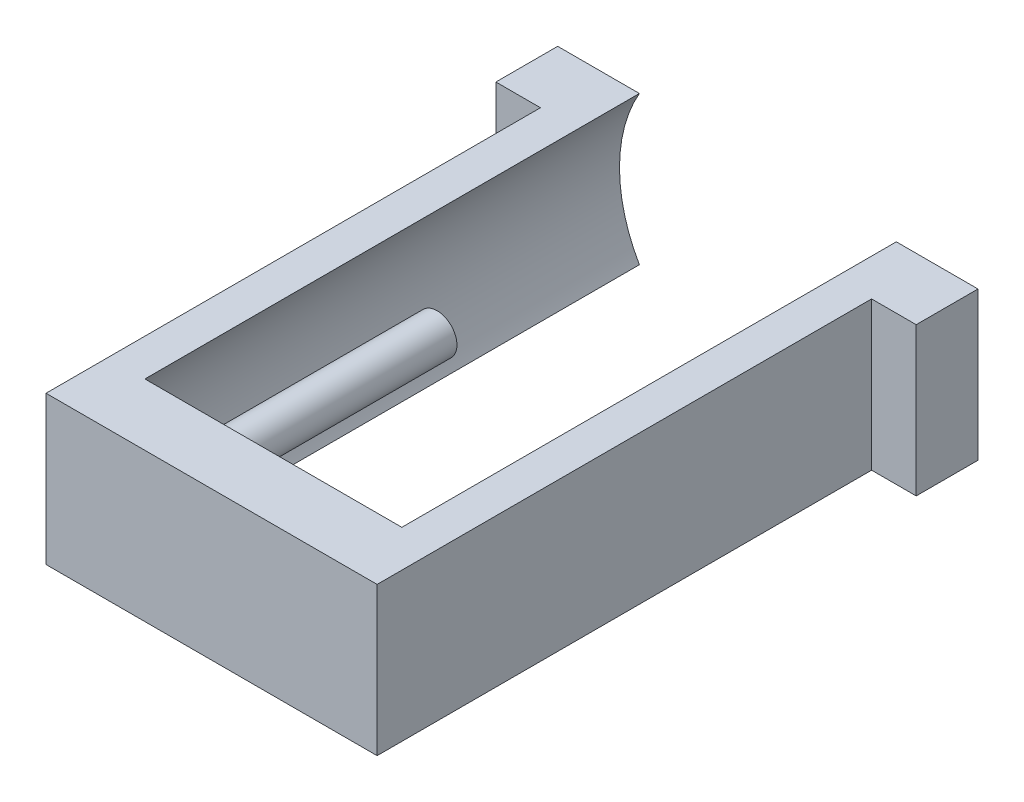
ISO-10303-21;
HEADER;
FILE_DESCRIPTION(('STEP AP214'),'2;1');
FILE_NAME('part.step','',(''),(''),'','','');
FILE_SCHEMA(('AUTOMOTIVE_DESIGN { 1 0 10303 214 1 1 1 1 }'));
ENDSEC;
DATA;
#1=APPLICATION_CONTEXT('core data for automotive mechanical design processes');
#2=APPLICATION_PROTOCOL_DEFINITION('international standard','automotive_design',2000,#1);
#3=PRODUCT_CONTEXT('',#1,'mechanical');
#4=PRODUCT('Part','Part','',(#3));
#5=PRODUCT_RELATED_PRODUCT_CATEGORY('part','',(#4));
#6=PRODUCT_DEFINITION_FORMATION('','',#4);
#7=PRODUCT_DEFINITION_CONTEXT('part definition',#1,'design');
#8=PRODUCT_DEFINITION('design','',#6,#7);
#9=PRODUCT_DEFINITION_SHAPE('','',#8);
#10=(LENGTH_UNIT() NAMED_UNIT(*) SI_UNIT(.MILLI.,.METRE.));
#11=(NAMED_UNIT(*) PLANE_ANGLE_UNIT() SI_UNIT($,.RADIAN.));
#12=(NAMED_UNIT(*) SI_UNIT($,.STERADIAN.) SOLID_ANGLE_UNIT());
#13=UNCERTAINTY_MEASURE_WITH_UNIT(LENGTH_MEASURE(1.E-05),#10,'distance_accuracy_value','');
#14=(GEOMETRIC_REPRESENTATION_CONTEXT(3) GLOBAL_UNCERTAINTY_ASSIGNED_CONTEXT((#13)) GLOBAL_UNIT_ASSIGNED_CONTEXT((#10,
#11,#12)) REPRESENTATION_CONTEXT('',''));
#15=CARTESIAN_POINT('',(0.,0.,0.));
#16=DIRECTION('',(0.,0.,1.));
#17=DIRECTION('',(1.,0.,0.));
#18=AXIS2_PLACEMENT_3D('',#15,#16,#17);
#19=CARTESIAN_POINT('',(0.,0.,5.));
#20=DIRECTION('',(0.,0.,-1.));
#21=DIRECTION('',(-1.,0.,0.));
#22=AXIS2_PLACEMENT_3D('',#19,#20,#21);
#23=CYLINDRICAL_SURFACE('',#22,12.);
#24=CARTESIAN_POINT('',(0.,0.,0.));
#25=DIRECTION('',(0.,0.,-1.));
#26=DIRECTION('',(1.,0.,0.));
#27=AXIS2_PLACEMENT_3D('',#24,#25,#26);
#28=CIRCLE('',#27,12.);
#29=CARTESIAN_POINT('',(-10.3923048454133,-6.,0.));
#30=VERTEX_POINT('',#29);
#31=CARTESIAN_POINT('',(-10.3923048454133,6.,0.));
#32=VERTEX_POINT('',#31);
#33=EDGE_CURVE('E231',#30,#32,#28,.T.);
#34=ORIENTED_EDGE('',*,*,#33,.T.);
#35=DIRECTION('',(0.,0.,-1.));
#36=VECTOR('',#35,1.);
#37=CARTESIAN_POINT('',(-10.3923048454133,6.,5.));
#38=LINE('',#37,#36);
#39=CARTESIAN_POINT('',(-10.3923048454133,6.,40.));
#40=VERTEX_POINT('',#39);
#41=EDGE_CURVE('E11',#40,#32,#38,.T.);
#42=ORIENTED_EDGE('',*,*,#41,.F.);
#43=CARTESIAN_POINT('',(0.,0.,40.));
#44=DIRECTION('',(0.,0.,-1.));
#45=DIRECTION('',(1.,0.,0.));
#46=AXIS2_PLACEMENT_3D('',#43,#44,#45);
#47=CIRCLE('',#46,12.);
#48=CARTESIAN_POINT('',(-10.3923048454133,-6.,40.));
#49=VERTEX_POINT('',#48);
#50=EDGE_CURVE('E198',#49,#40,#47,.T.);
#51=ORIENTED_EDGE('',*,*,#50,.F.);
#52=DIRECTION('',(0.,0.,-1.));
#53=VECTOR('',#52,1.);
#54=CARTESIAN_POINT('',(-10.3923048454133,-6.,5.));
#55=LINE('',#54,#53);
#56=EDGE_CURVE('E206',#49,#30,#55,.T.);
#57=ORIENTED_EDGE('',*,*,#56,.T.);
#58=EDGE_LOOP('',(#34,#42,#51,#57));
#59=FACE_BOUND('',#58,.T.);
#60=ADVANCED_FACE('F33',(#59),#23,.F.);
#61=CARTESIAN_POINT('',(-17.,6.,5.));
#62=DIRECTION('',(0.,-1.,0.));
#63=DIRECTION('',(0.,0.,-1.));
#64=AXIS2_PLACEMENT_3D('',#61,#62,#63);
#65=PLANE('',#64);
#66=DIRECTION('',(-1.,0.,0.));
#67=VECTOR('',#66,1.);
#68=CARTESIAN_POINT('',(-17.,6.,0.));
#69=LINE('',#68,#67);
#70=CARTESIAN_POINT('',(-17.,6.,0.));
#71=VERTEX_POINT('',#70);
#72=EDGE_CURVE('E233',#32,#71,#69,.T.);
#73=ORIENTED_EDGE('',*,*,#72,.T.);
#74=DIRECTION('',(0.,0.,-1.));
#75=VECTOR('',#74,1.);
#76=CARTESIAN_POINT('',(-17.,6.,5.));
#77=LINE('',#76,#75);
#78=CARTESIAN_POINT('',(-17.,6.,5.));
#79=VERTEX_POINT('',#78);
#80=EDGE_CURVE('E42',#79,#71,#77,.T.);
#81=ORIENTED_EDGE('',*,*,#80,.F.);
#82=DIRECTION('',(-1.,0.,0.));
#83=VECTOR('',#82,1.);
#84=CARTESIAN_POINT('',(-17.,6.,5.));
#85=LINE('',#84,#83);
#86=CARTESIAN_POINT('',(-13.3923048454133,6.,5.));
#87=VERTEX_POINT('',#86);
#88=EDGE_CURVE('E222',#87,#79,#85,.T.);
#89=ORIENTED_EDGE('',*,*,#88,.F.);
#90=DIRECTION('',(0.,0.,-1.));
#91=VECTOR('',#90,1.);
#92=CARTESIAN_POINT('',(-13.3923048454133,6.,40.));
#93=LINE('',#92,#91);
#94=CARTESIAN_POINT('',(-13.3923048454133,6.,45.));
#95=VERTEX_POINT('',#94);
#96=EDGE_CURVE('E234',#95,#87,#93,.T.);
#97=ORIENTED_EDGE('',*,*,#96,.F.);
#98=DIRECTION('',(-1.,0.,0.));
#99=VECTOR('',#98,1.);
#100=CARTESIAN_POINT('',(-13.3923048454133,6.,45.));
#101=LINE('',#100,#99);
#102=CARTESIAN_POINT('',(13.3923048454133,6.,45.));
#103=VERTEX_POINT('',#102);
#104=EDGE_CURVE('E179',#103,#95,#101,.T.);
#105=ORIENTED_EDGE('',*,*,#104,.F.);
#106=DIRECTION('',(0.,0.,-1.));
#107=VECTOR('',#106,1.);
#108=CARTESIAN_POINT('',(13.3923048454133,6.,45.));
#109=LINE('',#108,#107);
#110=CARTESIAN_POINT('',(13.3923048454133,6.,5.));
#111=VERTEX_POINT('',#110);
#112=EDGE_CURVE('E174',#103,#111,#109,.T.);
#113=ORIENTED_EDGE('',*,*,#112,.T.);
#114=DIRECTION('',(1.,0.,0.));
#115=VECTOR('',#114,1.);
#116=CARTESIAN_POINT('',(17.,6.,5.));
#117=LINE('',#116,#115);
#118=CARTESIAN_POINT('',(17.,6.,5.));
#119=VERTEX_POINT('',#118);
#120=EDGE_CURVE('E147',#111,#119,#117,.T.);
#121=ORIENTED_EDGE('',*,*,#120,.T.);
#122=DIRECTION('',(0.,0.,-1.));
#123=VECTOR('',#122,1.);
#124=CARTESIAN_POINT('',(17.,6.,5.));
#125=LINE('',#124,#123);
#126=CARTESIAN_POINT('',(17.,6.,0.));
#127=VERTEX_POINT('',#126);
#128=EDGE_CURVE('E135',#119,#127,#125,.T.);
#129=ORIENTED_EDGE('',*,*,#128,.T.);
#130=DIRECTION('',(1.,0.,0.));
#131=VECTOR('',#130,1.);
#132=CARTESIAN_POINT('',(17.,6.,0.));
#133=LINE('',#132,#131);
#134=CARTESIAN_POINT('',(10.3923048454133,6.,0.));
#135=VERTEX_POINT('',#134);
#136=EDGE_CURVE('E143',#135,#127,#133,.T.);
#137=ORIENTED_EDGE('',*,*,#136,.F.);
#138=DIRECTION('',(0.,0.,-1.));
#139=VECTOR('',#138,1.);
#140=CARTESIAN_POINT('',(10.3923048454133,6.,40.));
#141=LINE('',#140,#139);
#142=CARTESIAN_POINT('',(10.3923048454133,6.00000000000001,40.));
#143=VERTEX_POINT('',#142);
#144=EDGE_CURVE('E163',#143,#135,#141,.T.);
#145=ORIENTED_EDGE('',*,*,#144,.F.);
#146=DIRECTION('',(-1.,0.,0.));
#147=VECTOR('',#146,1.);
#148=CARTESIAN_POINT('',(-13.3923048454133,6.,40.));
#149=LINE('',#148,#147);
#150=EDGE_CURVE('E36',#143,#40,#149,.T.);
#151=ORIENTED_EDGE('',*,*,#150,.T.);
#152=ORIENTED_EDGE('',*,*,#41,.T.);
#153=EDGE_LOOP('',(#73,#81,#89,#97,#105,#113,#121,#129,#137,#145,#151,#152));
#154=FACE_BOUND('',#153,.T.);
#155=ADVANCED_FACE('F259',(#154),#65,.F.);
#156=CARTESIAN_POINT('',(-17.,6.,5.));
#157=DIRECTION('',(1.,0.,0.));
#158=DIRECTION('',(0.,0.,-1.));
#159=AXIS2_PLACEMENT_3D('',#156,#157,#158);
#160=PLANE('',#159);
#161=DIRECTION('',(0.,-1.,0.));
#162=VECTOR('',#161,1.);
#163=CARTESIAN_POINT('',(-17.,6.,0.));
#164=LINE('',#163,#162);
#165=CARTESIAN_POINT('',(-17.,-6.,0.));
#166=VERTEX_POINT('',#165);
#167=EDGE_CURVE('E236',#71,#166,#164,.T.);
#168=ORIENTED_EDGE('',*,*,#167,.T.);
#169=DIRECTION('',(0.,0.,-1.));
#170=VECTOR('',#169,1.);
#171=CARTESIAN_POINT('',(-17.,-6.,5.));
#172=LINE('',#171,#170);
#173=CARTESIAN_POINT('',(-17.,-6.,5.));
#174=VERTEX_POINT('',#173);
#175=EDGE_CURVE('E208',#174,#166,#172,.T.);
#176=ORIENTED_EDGE('',*,*,#175,.F.);
#177=DIRECTION('',(0.,-1.,0.));
#178=VECTOR('',#177,1.);
#179=CARTESIAN_POINT('',(-17.,6.,5.));
#180=LINE('',#179,#178);
#181=EDGE_CURVE('E217',#79,#174,#180,.T.);
#182=ORIENTED_EDGE('',*,*,#181,.F.);
#183=ORIENTED_EDGE('',*,*,#80,.T.);
#184=EDGE_LOOP('',(#168,#176,#182,#183));
#185=FACE_BOUND('',#184,.T.);
#186=ADVANCED_FACE('F244',(#185),#160,.F.);
#187=CARTESIAN_POINT('',(-17.,-6.,5.));
#188=DIRECTION('',(0.,1.,0.));
#189=DIRECTION('',(0.,0.,1.));
#190=AXIS2_PLACEMENT_3D('',#187,#188,#189);
#191=PLANE('',#190);
#192=DIRECTION('',(1.,0.,0.));
#193=VECTOR('',#192,1.);
#194=CARTESIAN_POINT('',(-17.,-6.,0.));
#195=LINE('',#194,#193);
#196=EDGE_CURVE('E238',#166,#30,#195,.T.);
#197=ORIENTED_EDGE('',*,*,#196,.T.);
#198=ORIENTED_EDGE('',*,*,#56,.F.);
#199=DIRECTION('',(1.,0.,0.));
#200=VECTOR('',#199,1.);
#201=CARTESIAN_POINT('',(-13.3923048454133,-6.,40.));
#202=LINE('',#201,#200);
#203=CARTESIAN_POINT('',(10.3923048454133,-5.99999999999999,40.));
#204=VERTEX_POINT('',#203);
#205=EDGE_CURVE('E183',#49,#204,#202,.T.);
#206=ORIENTED_EDGE('',*,*,#205,.T.);
#207=DIRECTION('',(0.,0.,-1.));
#208=VECTOR('',#207,1.);
#209=CARTESIAN_POINT('',(10.3923048454133,-6.,40.));
#210=LINE('',#209,#208);
#211=CARTESIAN_POINT('',(10.3923048454133,-6.,0.));
#212=VERTEX_POINT('',#211);
#213=EDGE_CURVE('E166',#204,#212,#210,.T.);
#214=ORIENTED_EDGE('',*,*,#213,.T.);
#215=DIRECTION('',(-1.,0.,0.));
#216=VECTOR('',#215,1.);
#217=CARTESIAN_POINT('',(17.,-6.,0.));
#218=LINE('',#217,#216);
#219=CARTESIAN_POINT('',(17.,-6.,0.));
#220=VERTEX_POINT('',#219);
#221=EDGE_CURVE('E129',#220,#212,#218,.T.);
#222=ORIENTED_EDGE('',*,*,#221,.F.);
#223=DIRECTION('',(0.,0.,-1.));
#224=VECTOR('',#223,1.);
#225=CARTESIAN_POINT('',(17.,-6.,5.));
#226=LINE('',#225,#224);
#227=CARTESIAN_POINT('',(17.,-6.,5.));
#228=VERTEX_POINT('',#227);
#229=EDGE_CURVE('E123',#228,#220,#226,.T.);
#230=ORIENTED_EDGE('',*,*,#229,.F.);
#231=DIRECTION('',(-1.,0.,0.));
#232=VECTOR('',#231,1.);
#233=CARTESIAN_POINT('',(17.,-6.,5.));
#234=LINE('',#233,#232);
#235=CARTESIAN_POINT('',(13.3923048454133,-6.,5.));
#236=VERTEX_POINT('',#235);
#237=EDGE_CURVE('E127',#228,#236,#234,.T.);
#238=ORIENTED_EDGE('',*,*,#237,.T.);
#239=DIRECTION('',(0.,0.,-1.));
#240=VECTOR('',#239,1.);
#241=CARTESIAN_POINT('',(13.3923048454133,-6.,45.));
#242=LINE('',#241,#240);
#243=CARTESIAN_POINT('',(13.3923048454133,-6.,45.));
#244=VERTEX_POINT('',#243);
#245=EDGE_CURVE('E177',#244,#236,#242,.T.);
#246=ORIENTED_EDGE('',*,*,#245,.F.);
#247=DIRECTION('',(1.,0.,0.));
#248=VECTOR('',#247,1.);
#249=CARTESIAN_POINT('',(-13.3923048454133,-6.,45.));
#250=LINE('',#249,#248);
#251=CARTESIAN_POINT('',(-13.3923048454133,-6.,45.));
#252=VERTEX_POINT('',#251);
#253=EDGE_CURVE('E186',#252,#244,#250,.T.);
#254=ORIENTED_EDGE('',*,*,#253,.F.);
#255=DIRECTION('',(0.,0.,-1.));
#256=VECTOR('',#255,1.);
#257=CARTESIAN_POINT('',(-13.3923048454133,-6.,40.));
#258=LINE('',#257,#256);
#259=CARTESIAN_POINT('',(-13.3923048454133,-6.,5.));
#260=VERTEX_POINT('',#259);
#261=EDGE_CURVE('E200',#252,#260,#258,.T.);
#262=ORIENTED_EDGE('',*,*,#261,.T.);
#263=DIRECTION('',(1.,0.,0.));
#264=VECTOR('',#263,1.);
#265=CARTESIAN_POINT('',(-17.,-6.,5.));
#266=LINE('',#265,#264);
#267=EDGE_CURVE('E209',#174,#260,#266,.T.);
#268=ORIENTED_EDGE('',*,*,#267,.F.);
#269=ORIENTED_EDGE('',*,*,#175,.T.);
#270=EDGE_LOOP('',(#197,#198,#206,#214,#222,#230,#238,#246,#254,#262,#268,#269));
#271=FACE_BOUND('',#270,.T.);
#272=ADVANCED_FACE('F125',(#271),#191,.F.);
#273=CARTESIAN_POINT('',(0.,0.,5.));
#274=DIRECTION('',(0.,0.,1.));
#275=DIRECTION('',(1.,0.,0.));
#276=AXIS2_PLACEMENT_3D('',#273,#274,#275);
#277=PLANE('',#276);
#278=DIRECTION('',(0.,-1.,0.));
#279=VECTOR('',#278,1.);
#280=CARTESIAN_POINT('',(-13.3923048454133,6.,5.));
#281=LINE('',#280,#279);
#282=EDGE_CURVE('E187',#87,#260,#281,.T.);
#283=ORIENTED_EDGE('',*,*,#282,.F.);
#284=ORIENTED_EDGE('',*,*,#88,.T.);
#285=ORIENTED_EDGE('',*,*,#181,.T.);
#286=ORIENTED_EDGE('',*,*,#267,.T.);
#287=EDGE_LOOP('',(#283,#284,#285,#286));
#288=FACE_BOUND('',#287,.T.);
#289=ADVANCED_FACE('F261',(#288),#277,.T.);
#290=CARTESIAN_POINT('',(0.,0.,0.));
#291=DIRECTION('',(0.,0.,1.));
#292=DIRECTION('',(1.,0.,0.));
#293=AXIS2_PLACEMENT_3D('',#290,#291,#292);
#294=PLANE('',#293);
#295=ORIENTED_EDGE('',*,*,#33,.F.);
#296=ORIENTED_EDGE('',*,*,#196,.F.);
#297=ORIENTED_EDGE('',*,*,#167,.F.);
#298=ORIENTED_EDGE('',*,*,#72,.F.);
#299=EDGE_LOOP('',(#295,#296,#297,#298));
#300=FACE_BOUND('',#299,.T.);
#301=ADVANCED_FACE('F250',(#300),#294,.F.);
#302=CARTESIAN_POINT('',(-13.3923048454133,6.,40.));
#303=DIRECTION('',(1.,0.,0.));
#304=DIRECTION('',(0.,1.,0.));
#305=AXIS2_PLACEMENT_3D('',#302,#303,#304);
#306=PLANE('',#305);
#307=ORIENTED_EDGE('',*,*,#282,.T.);
#308=ORIENTED_EDGE('',*,*,#261,.F.);
#309=DIRECTION('',(0.,-1.,0.));
#310=VECTOR('',#309,1.);
#311=CARTESIAN_POINT('',(-13.3923048454133,6.,45.));
#312=LINE('',#311,#310);
#313=EDGE_CURVE('E182',#95,#252,#312,.T.);
#314=ORIENTED_EDGE('',*,*,#313,.F.);
#315=ORIENTED_EDGE('',*,*,#96,.T.);
#316=EDGE_LOOP('',(#307,#308,#314,#315));
#317=FACE_BOUND('',#316,.T.);
#318=ADVANCED_FACE('F258',(#317),#306,.F.);
#319=CARTESIAN_POINT('',(0.,0.,45.));
#320=DIRECTION('',(0.,0.,-1.));
#321=DIRECTION('',(-1.,0.,0.));
#322=AXIS2_PLACEMENT_3D('',#319,#320,#321);
#323=PLANE('',#322);
#324=ORIENTED_EDGE('',*,*,#104,.T.);
#325=ORIENTED_EDGE('',*,*,#313,.T.);
#326=ORIENTED_EDGE('',*,*,#253,.T.);
#327=DIRECTION('',(0.,-1.,0.));
#328=VECTOR('',#327,1.);
#329=CARTESIAN_POINT('',(13.3923048454133,6.,45.));
#330=LINE('',#329,#328);
#331=EDGE_CURVE('E171',#103,#244,#330,.T.);
#332=ORIENTED_EDGE('',*,*,#331,.F.);
#333=EDGE_LOOP('',(#324,#325,#326,#332));
#334=FACE_BOUND('',#333,.T.);
#335=ADVANCED_FACE('F289',(#334),#323,.F.);
#336=CARTESIAN_POINT('',(0.,0.,40.));
#337=DIRECTION('',(0.,0.,-1.));
#338=DIRECTION('',(-1.,0.,0.));
#339=AXIS2_PLACEMENT_3D('',#336,#337,#338);
#340=PLANE('',#339);
#341=CARTESIAN_POINT('',(0.,0.,40.));
#342=DIRECTION('',(0.,0.,1.));
#343=DIRECTION('',(-1.,0.,0.));
#344=AXIS2_PLACEMENT_3D('',#341,#342,#343);
#345=CIRCLE('',#344,12.);
#346=EDGE_CURVE('E54',#204,#143,#345,.T.);
#347=ORIENTED_EDGE('',*,*,#346,.F.);
#348=ORIENTED_EDGE('',*,*,#205,.F.);
#349=ORIENTED_EDGE('',*,*,#50,.T.);
#350=ORIENTED_EDGE('',*,*,#150,.F.);
#351=EDGE_LOOP('',(#347,#348,#349,#350));
#352=FACE_BOUND('',#351,.T.);
#353=CARTESIAN_POINT('',(-7.75,0.,40.));
#354=DIRECTION('',(0.,0.,-1.));
#355=DIRECTION('',(-1.,0.,0.));
#356=AXIS2_PLACEMENT_3D('',#353,#354,#355);
#357=CIRCLE('',#356,1.6);
#358=CARTESIAN_POINT('',(-6.15,0.,40.));
#359=VERTEX_POINT('',#358);
#360=EDGE_CURVE('E155',#359,#359,#357,.T.);
#361=ORIENTED_EDGE('',*,*,#360,.F.);
#362=EDGE_LOOP('',(#361));
#363=FACE_BOUND('',#362,.T.);
#364=CARTESIAN_POINT('',(7.75,0.,40.));
#365=DIRECTION('',(0.,0.,-1.));
#366=DIRECTION('',(-1.,0.,0.));
#367=AXIS2_PLACEMENT_3D('',#364,#365,#366);
#368=CIRCLE('',#367,1.6);
#369=CARTESIAN_POINT('',(9.35,0.,40.));
#370=VERTEX_POINT('',#369);
#371=EDGE_CURVE('E168',#370,#370,#368,.T.);
#372=ORIENTED_EDGE('',*,*,#371,.F.);
#373=EDGE_LOOP('',(#372));
#374=FACE_BOUND('',#373,.T.);
#375=ADVANCED_FACE('F276',(#352,#363,#374),#340,.T.);
#376=CARTESIAN_POINT('',(13.3923048454133,6.,45.));
#377=DIRECTION('',(1.,0.,0.));
#378=DIRECTION('',(0.,1.,0.));
#379=AXIS2_PLACEMENT_3D('',#376,#377,#378);
#380=PLANE('',#379);
#381=ORIENTED_EDGE('',*,*,#245,.T.);
#382=DIRECTION('',(0.,-1.,0.));
#383=VECTOR('',#382,1.);
#384=CARTESIAN_POINT('',(13.3923048454133,6.,5.));
#385=LINE('',#384,#383);
#386=EDGE_CURVE('E134',#111,#236,#385,.T.);
#387=ORIENTED_EDGE('',*,*,#386,.F.);
#388=ORIENTED_EDGE('',*,*,#112,.F.);
#389=ORIENTED_EDGE('',*,*,#331,.T.);
#390=EDGE_LOOP('',(#381,#387,#388,#389));
#391=FACE_BOUND('',#390,.T.);
#392=ADVANCED_FACE('F287',(#391),#380,.T.);
#393=CARTESIAN_POINT('',(0.,0.,40.));
#394=DIRECTION('',(0.,0.,-1.));
#395=DIRECTION('',(-1.,0.,0.));
#396=AXIS2_PLACEMENT_3D('',#393,#394,#395);
#397=CYLINDRICAL_SURFACE('',#396,12.);
#398=ORIENTED_EDGE('',*,*,#144,.T.);
#399=CARTESIAN_POINT('',(0.,0.,0.));
#400=DIRECTION('',(0.,0.,1.));
#401=DIRECTION('',(-1.,0.,0.));
#402=AXIS2_PLACEMENT_3D('',#399,#400,#401);
#403=CIRCLE('',#402,12.);
#404=EDGE_CURVE('E152',#212,#135,#403,.T.);
#405=ORIENTED_EDGE('',*,*,#404,.F.);
#406=ORIENTED_EDGE('',*,*,#213,.F.);
#407=ORIENTED_EDGE('',*,*,#346,.T.);
#408=EDGE_LOOP('',(#398,#405,#406,#407));
#409=FACE_BOUND('',#408,.T.);
#410=ADVANCED_FACE('F281',(#409),#397,.F.);
#411=CARTESIAN_POINT('',(17.,6.,5.));
#412=DIRECTION('',(1.,0.,0.));
#413=DIRECTION('',(0.,0.,-1.));
#414=AXIS2_PLACEMENT_3D('',#411,#412,#413);
#415=PLANE('',#414);
#416=DIRECTION('',(0.,-1.,0.));
#417=VECTOR('',#416,1.);
#418=CARTESIAN_POINT('',(17.,6.,0.));
#419=LINE('',#418,#417);
#420=EDGE_CURVE('E157',#127,#220,#419,.T.);
#421=ORIENTED_EDGE('',*,*,#420,.F.);
#422=ORIENTED_EDGE('',*,*,#128,.F.);
#423=DIRECTION('',(0.,-1.,0.));
#424=VECTOR('',#423,1.);
#425=CARTESIAN_POINT('',(17.,6.,5.));
#426=LINE('',#425,#424);
#427=EDGE_CURVE('E142',#119,#228,#426,.T.);
#428=ORIENTED_EDGE('',*,*,#427,.T.);
#429=ORIENTED_EDGE('',*,*,#229,.T.);
#430=EDGE_LOOP('',(#421,#422,#428,#429));
#431=FACE_BOUND('',#430,.T.);
#432=ADVANCED_FACE('F146',(#431),#415,.T.);
#433=CARTESIAN_POINT('',(0.,0.,5.));
#434=DIRECTION('',(0.,0.,1.));
#435=DIRECTION('',(-1.,0.,0.));
#436=AXIS2_PLACEMENT_3D('',#433,#434,#435);
#437=PLANE('',#436);
#438=ORIENTED_EDGE('',*,*,#120,.F.);
#439=ORIENTED_EDGE('',*,*,#386,.T.);
#440=ORIENTED_EDGE('',*,*,#237,.F.);
#441=ORIENTED_EDGE('',*,*,#427,.F.);
#442=EDGE_LOOP('',(#438,#439,#440,#441));
#443=FACE_BOUND('',#442,.T.);
#444=ADVANCED_FACE('F141',(#443),#437,.T.);
#445=CARTESIAN_POINT('',(0.,0.,0.));
#446=DIRECTION('',(0.,0.,1.));
#447=DIRECTION('',(-1.,0.,0.));
#448=AXIS2_PLACEMENT_3D('',#445,#446,#447);
#449=PLANE('',#448);
#450=ORIENTED_EDGE('',*,*,#404,.T.);
#451=ORIENTED_EDGE('',*,*,#136,.T.);
#452=ORIENTED_EDGE('',*,*,#420,.T.);
#453=ORIENTED_EDGE('',*,*,#221,.T.);
#454=EDGE_LOOP('',(#450,#451,#452,#453));
#455=FACE_BOUND('',#454,.T.);
#456=ADVANCED_FACE('F284',(#455),#449,.F.);
#457=CARTESIAN_POINT('',(-7.75,0.,19.));
#458=DIRECTION('',(0.,0.,1.));
#459=DIRECTION('',(1.,0.,0.));
#460=AXIS2_PLACEMENT_3D('',#457,#458,#459);
#461=CYLINDRICAL_SURFACE('',#460,1.6);
#462=CARTESIAN_POINT('',(-7.75,0.,19.));
#463=DIRECTION('',(0.,0.,1.));
#464=DIRECTION('',(1.,0.,0.));
#465=AXIS2_PLACEMENT_3D('',#462,#463,#464);
#466=CIRCLE('',#465,1.6);
#467=CARTESIAN_POINT('',(-6.15,0.,19.));
#468=VERTEX_POINT('',#467);
#469=EDGE_CURVE('E329',#468,#468,#466,.T.);
#470=CARTESIAN_POINT('',(-6.15,0.,40.));
#471=CARTESIAN_POINT('',(-6.15,0.,39.78125));
#472=CARTESIAN_POINT('',(-6.15,0.,39.5625));
#473=CARTESIAN_POINT('',(-6.15,0.,39.125));
#474=CARTESIAN_POINT('',(-6.15,0.,38.90625));
#475=CARTESIAN_POINT('',(-6.15,0.,38.46875));
#476=CARTESIAN_POINT('',(-6.15,0.,38.25));
#477=CARTESIAN_POINT('',(-6.15,0.,37.8125));
#478=CARTESIAN_POINT('',(-6.15,0.,37.59375));
#479=CARTESIAN_POINT('',(-6.15,0.,37.15625));
#480=CARTESIAN_POINT('',(-6.15,0.,36.9375));
#481=CARTESIAN_POINT('',(-6.15,0.,36.5));
#482=CARTESIAN_POINT('',(-6.15,0.,36.28125));
#483=CARTESIAN_POINT('',(-6.15,0.,35.84375));
#484=CARTESIAN_POINT('',(-6.15,0.,35.625));
#485=CARTESIAN_POINT('',(-6.15,0.,35.1875));
#486=CARTESIAN_POINT('',(-6.15,0.,34.96875));
#487=CARTESIAN_POINT('',(-6.15,0.,34.53125));
#488=CARTESIAN_POINT('',(-6.15,0.,34.3125));
#489=CARTESIAN_POINT('',(-6.15,0.,33.875));
#490=CARTESIAN_POINT('',(-6.15,0.,33.65625));
#491=CARTESIAN_POINT('',(-6.15,0.,33.21875));
#492=CARTESIAN_POINT('',(-6.15,0.,33.));
#493=CARTESIAN_POINT('',(-6.15,0.,32.5625));
#494=CARTESIAN_POINT('',(-6.15,0.,32.34375));
#495=CARTESIAN_POINT('',(-6.15,0.,31.90625));
#496=CARTESIAN_POINT('',(-6.15,0.,31.6875));
#497=CARTESIAN_POINT('',(-6.15,0.,31.25));
#498=CARTESIAN_POINT('',(-6.15,0.,31.03125));
#499=CARTESIAN_POINT('',(-6.15,0.,30.59375));
#500=CARTESIAN_POINT('',(-6.15,0.,30.375));
#501=CARTESIAN_POINT('',(-6.15,0.,29.9375));
#502=CARTESIAN_POINT('',(-6.15,0.,29.71875));
#503=CARTESIAN_POINT('',(-6.15,0.,29.28125));
#504=CARTESIAN_POINT('',(-6.15,0.,29.0625));
#505=CARTESIAN_POINT('',(-6.15,0.,28.625));
#506=CARTESIAN_POINT('',(-6.15,0.,28.40625));
#507=CARTESIAN_POINT('',(-6.15,0.,27.96875));
#508=CARTESIAN_POINT('',(-6.15,0.,27.75));
#509=CARTESIAN_POINT('',(-6.15,0.,27.3125));
#510=CARTESIAN_POINT('',(-6.15,0.,27.09375));
#511=CARTESIAN_POINT('',(-6.15,0.,26.65625));
#512=CARTESIAN_POINT('',(-6.15,0.,26.4375));
#513=CARTESIAN_POINT('',(-6.15,0.,26.));
#514=CARTESIAN_POINT('',(-6.15,0.,25.78125));
#515=CARTESIAN_POINT('',(-6.15,0.,25.34375));
#516=CARTESIAN_POINT('',(-6.15,0.,25.125));
#517=CARTESIAN_POINT('',(-6.15,0.,24.6875));
#518=CARTESIAN_POINT('',(-6.15,0.,24.46875));
#519=CARTESIAN_POINT('',(-6.15,0.,24.03125));
#520=CARTESIAN_POINT('',(-6.15,0.,23.8125));
#521=CARTESIAN_POINT('',(-6.15,0.,23.375));
#522=CARTESIAN_POINT('',(-6.15,0.,23.15625));
#523=CARTESIAN_POINT('',(-6.15,0.,22.71875));
#524=CARTESIAN_POINT('',(-6.15,0.,22.5));
#525=CARTESIAN_POINT('',(-6.15,0.,22.0625));
#526=CARTESIAN_POINT('',(-6.15,0.,21.84375));
#527=CARTESIAN_POINT('',(-6.15,0.,21.40625));
#528=CARTESIAN_POINT('',(-6.15,0.,21.1875));
#529=CARTESIAN_POINT('',(-6.15,0.,20.75));
#530=CARTESIAN_POINT('',(-6.15,0.,20.53125));
#531=CARTESIAN_POINT('',(-6.15,0.,20.09375));
#532=CARTESIAN_POINT('',(-6.15,0.,19.875));
#533=CARTESIAN_POINT('',(-6.15,0.,19.4375));
#534=CARTESIAN_POINT('',(-6.15,0.,19.21875));
#535=CARTESIAN_POINT('',(-6.15,0.,19.));
#536=B_SPLINE_CURVE_WITH_KNOTS('',3,(#470,#471,#472,#473,#474,#475,#476,#477,#478,#479,#480,
#481,#482,#483,#484,#485,#486,#487,#488,#489,#490,#491,#492,#493,#494,#495,#496,#497,#498,#499,
#500,#501,#502,#503,#504,#505,#506,#507,#508,#509,#510,#511,#512,#513,#514,#515,#516,#517,#518,
#519,#520,#521,#522,#523,#524,#525,#526,#527,#528,#529,#530,#531,#532,#533,#534,#535),
.UNSPECIFIED.,.F.,.F.,(4,2,2,2,2,2,2,2,2,2,2,2,2,2,2,2,2,2,2,2,2,2,2,2,2,2,2,2,2,2,2,2,4),(0.,
0.656250000000004,1.3125,1.96875,2.625,3.28125,3.9375,4.59375,5.25,5.90625,6.5625,7.21875,7.875,
8.53125,9.1875,9.84375,10.5,11.15625,11.8125,12.46875,13.125,13.78125,14.4375,15.09375,15.75,
16.40625,17.0625,17.71875,18.375,19.03125,19.6875,20.34375,21.),.UNSPECIFIED.);
#537=EDGE_CURVE('BSEAM306',#359,#468,#536,.T.);
#538=ORIENTED_EDGE('',*,*,#360,.T.);
#539=ORIENTED_EDGE('',*,*,#469,.T.);
#540=ORIENTED_EDGE('',*,*,#537,.T.);
#541=ORIENTED_EDGE('',*,*,#537,.F.);
#542=EDGE_LOOP('',(#538,#540,#539,#541));
#543=FACE_BOUND('',#542,.T.);
#544=ADVANCED_FACE('F306',(#543),#461,.T.);
#545=CARTESIAN_POINT('',(-7.75,0.,19.));
#546=DIRECTION('',(0.,0.,1.));
#547=DIRECTION('',(1.,0.,0.));
#548=AXIS2_PLACEMENT_3D('',#545,#546,#547);
#549=PLANE('',#548);
#550=ORIENTED_EDGE('',*,*,#469,.F.);
#551=EDGE_LOOP('',(#550));
#552=FACE_BOUND('',#551,.T.);
#553=ADVANCED_FACE('F311',(#552),#549,.F.);
#554=CARTESIAN_POINT('',(7.75,0.,19.));
#555=DIRECTION('',(0.,0.,1.));
#556=DIRECTION('',(1.,0.,0.));
#557=AXIS2_PLACEMENT_3D('',#554,#555,#556);
#558=CYLINDRICAL_SURFACE('',#557,1.6);
#559=CARTESIAN_POINT('',(7.75,0.,19.));
#560=DIRECTION('',(0.,0.,-1.));
#561=DIRECTION('',(-1.,0.,0.));
#562=AXIS2_PLACEMENT_3D('',#559,#560,#561);
#563=CIRCLE('',#562,1.6);
#564=CARTESIAN_POINT('',(9.35,0.,19.));
#565=VERTEX_POINT('',#564);
#566=EDGE_CURVE('E327',#565,#565,#563,.T.);
#567=CARTESIAN_POINT('',(9.35,0.,40.));
#568=CARTESIAN_POINT('',(9.35,0.,39.78125));
#569=CARTESIAN_POINT('',(9.35,0.,39.5625));
#570=CARTESIAN_POINT('',(9.35,0.,39.125));
#571=CARTESIAN_POINT('',(9.35,0.,38.90625));
#572=CARTESIAN_POINT('',(9.35,0.,38.46875));
#573=CARTESIAN_POINT('',(9.35,0.,38.25));
#574=CARTESIAN_POINT('',(9.35,0.,37.8125));
#575=CARTESIAN_POINT('',(9.35,0.,37.59375));
#576=CARTESIAN_POINT('',(9.35,0.,37.15625));
#577=CARTESIAN_POINT('',(9.35,0.,36.9375));
#578=CARTESIAN_POINT('',(9.35,0.,36.5));
#579=CARTESIAN_POINT('',(9.35,0.,36.28125));
#580=CARTESIAN_POINT('',(9.35,0.,35.84375));
#581=CARTESIAN_POINT('',(9.35,0.,35.625));
#582=CARTESIAN_POINT('',(9.35,0.,35.1875));
#583=CARTESIAN_POINT('',(9.35,0.,34.96875));
#584=CARTESIAN_POINT('',(9.35,0.,34.53125));
#585=CARTESIAN_POINT('',(9.35,0.,34.3125));
#586=CARTESIAN_POINT('',(9.35,0.,33.875));
#587=CARTESIAN_POINT('',(9.35,0.,33.65625));
#588=CARTESIAN_POINT('',(9.35,0.,33.21875));
#589=CARTESIAN_POINT('',(9.35,0.,33.));
#590=CARTESIAN_POINT('',(9.35,0.,32.5625));
#591=CARTESIAN_POINT('',(9.35,0.,32.34375));
#592=CARTESIAN_POINT('',(9.35,0.,31.90625));
#593=CARTESIAN_POINT('',(9.35,0.,31.6875));
#594=CARTESIAN_POINT('',(9.35,0.,31.25));
#595=CARTESIAN_POINT('',(9.35,0.,31.03125));
#596=CARTESIAN_POINT('',(9.35,0.,30.59375));
#597=CARTESIAN_POINT('',(9.35,0.,30.375));
#598=CARTESIAN_POINT('',(9.35,0.,29.9375));
#599=CARTESIAN_POINT('',(9.35,0.,29.71875));
#600=CARTESIAN_POINT('',(9.35,0.,29.28125));
#601=CARTESIAN_POINT('',(9.35,0.,29.0625));
#602=CARTESIAN_POINT('',(9.35,0.,28.625));
#603=CARTESIAN_POINT('',(9.35,0.,28.40625));
#604=CARTESIAN_POINT('',(9.35,0.,27.96875));
#605=CARTESIAN_POINT('',(9.35,0.,27.75));
#606=CARTESIAN_POINT('',(9.35,0.,27.3125));
#607=CARTESIAN_POINT('',(9.35,0.,27.09375));
#608=CARTESIAN_POINT('',(9.35,0.,26.65625));
#609=CARTESIAN_POINT('',(9.35,0.,26.4375));
#610=CARTESIAN_POINT('',(9.35,0.,26.));
#611=CARTESIAN_POINT('',(9.35,0.,25.78125));
#612=CARTESIAN_POINT('',(9.35,0.,25.34375));
#613=CARTESIAN_POINT('',(9.35,0.,25.125));
#614=CARTESIAN_POINT('',(9.35,0.,24.6875));
#615=CARTESIAN_POINT('',(9.35,0.,24.46875));
#616=CARTESIAN_POINT('',(9.35,0.,24.03125));
#617=CARTESIAN_POINT('',(9.35,0.,23.8125));
#618=CARTESIAN_POINT('',(9.35,0.,23.375));
#619=CARTESIAN_POINT('',(9.35,0.,23.15625));
#620=CARTESIAN_POINT('',(9.35,0.,22.71875));
#621=CARTESIAN_POINT('',(9.35,0.,22.5));
#622=CARTESIAN_POINT('',(9.35,0.,22.0625));
#623=CARTESIAN_POINT('',(9.35,0.,21.84375));
#624=CARTESIAN_POINT('',(9.35,0.,21.40625));
#625=CARTESIAN_POINT('',(9.35,0.,21.1875));
#626=CARTESIAN_POINT('',(9.35,0.,20.75));
#627=CARTESIAN_POINT('',(9.35,0.,20.53125));
#628=CARTESIAN_POINT('',(9.35,0.,20.09375));
#629=CARTESIAN_POINT('',(9.35,0.,19.875));
#630=CARTESIAN_POINT('',(9.35,0.,19.4375));
#631=CARTESIAN_POINT('',(9.35,0.,19.21875));
#632=CARTESIAN_POINT('',(9.35,0.,19.));
#633=B_SPLINE_CURVE_WITH_KNOTS('',3,(#567,#568,#569,#570,#571,#572,#573,#574,#575,#576,#577,
#578,#579,#580,#581,#582,#583,#584,#585,#586,#587,#588,#589,#590,#591,#592,#593,#594,#595,#596,
#597,#598,#599,#600,#601,#602,#603,#604,#605,#606,#607,#608,#609,#610,#611,#612,#613,#614,#615,
#616,#617,#618,#619,#620,#621,#622,#623,#624,#625,#626,#627,#628,#629,#630,#631,#632),
.UNSPECIFIED.,.F.,.F.,(4,2,2,2,2,2,2,2,2,2,2,2,2,2,2,2,2,2,2,2,2,2,2,2,2,2,2,2,2,2,2,2,4),(0.,
0.656250000000004,1.3125,1.96875,2.625,3.28125,3.9375,4.59375,5.25,5.90624999999999,6.5625,
7.21875,7.875,8.53125,9.1875,9.84375,10.5,11.15625,11.8125,12.46875,13.125,13.78125,14.4375,
15.09375,15.75,16.40625,17.0625,17.71875,18.375,19.03125,19.6875,20.34375,21.),.UNSPECIFIED.);
#634=EDGE_CURVE('BSEAM315',#370,#565,#633,.T.);
#635=ORIENTED_EDGE('',*,*,#371,.T.);
#636=ORIENTED_EDGE('',*,*,#566,.F.);
#637=ORIENTED_EDGE('',*,*,#634,.T.);
#638=ORIENTED_EDGE('',*,*,#634,.F.);
#639=EDGE_LOOP('',(#635,#637,#636,#638));
#640=FACE_BOUND('',#639,.T.);
#641=ADVANCED_FACE('F315',(#640),#558,.T.);
#642=CARTESIAN_POINT('',(7.75,0.,19.));
#643=DIRECTION('',(0.,0.,1.));
#644=DIRECTION('',(-1.,0.,0.));
#645=AXIS2_PLACEMENT_3D('',#642,#643,#644);
#646=PLANE('',#645);
#647=ORIENTED_EDGE('',*,*,#566,.T.);
#648=EDGE_LOOP('',(#647));
#649=FACE_BOUND('',#648,.T.);
#650=ADVANCED_FACE('F319',(#649),#646,.F.);
#651=CLOSED_SHELL('',(#60,#155,#186,#272,#289,#301,#318,#335,#375,#392,#410,#432,#444,#456,#544,
#553,#641,#650));
#652=MANIFOLD_SOLID_BREP('B2',#651);
#653=ADVANCED_BREP_SHAPE_REPRESENTATION('',(#18,#652),#14);
#654=SHAPE_DEFINITION_REPRESENTATION(#9,#653);
ENDSEC;
END-ISO-10303-21;
